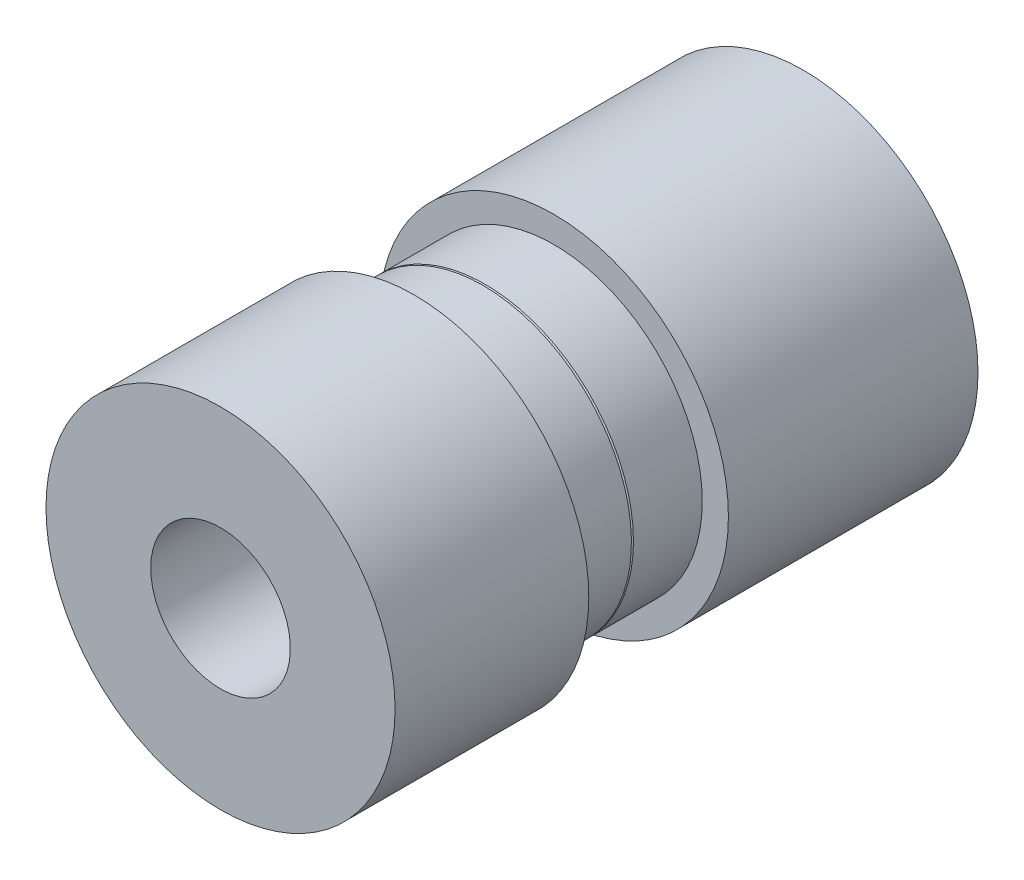
ISO-10303-21;
HEADER;
FILE_DESCRIPTION(('STEP AP214'),'2;1');
FILE_NAME('part.step','',(''),(''),'','','');
FILE_SCHEMA(('AUTOMOTIVE_DESIGN { 1 0 10303 214 1 1 1 1 }'));
ENDSEC;
DATA;
#1=APPLICATION_CONTEXT('core data for automotive mechanical design processes');
#2=APPLICATION_PROTOCOL_DEFINITION('international standard','automotive_design',2000,#1);
#3=PRODUCT_CONTEXT('',#1,'mechanical');
#4=PRODUCT('Part','Part','',(#3));
#5=PRODUCT_RELATED_PRODUCT_CATEGORY('part','',(#4));
#6=PRODUCT_DEFINITION_FORMATION('','',#4);
#7=PRODUCT_DEFINITION_CONTEXT('part definition',#1,'design');
#8=PRODUCT_DEFINITION('design','',#6,#7);
#9=PRODUCT_DEFINITION_SHAPE('','',#8);
#10=(LENGTH_UNIT() NAMED_UNIT(*) SI_UNIT(.MILLI.,.METRE.));
#11=(NAMED_UNIT(*) PLANE_ANGLE_UNIT() SI_UNIT($,.RADIAN.));
#12=(NAMED_UNIT(*) SI_UNIT($,.STERADIAN.) SOLID_ANGLE_UNIT());
#13=UNCERTAINTY_MEASURE_WITH_UNIT(LENGTH_MEASURE(1.E-05),#10,'distance_accuracy_value','');
#14=(GEOMETRIC_REPRESENTATION_CONTEXT(3) GLOBAL_UNCERTAINTY_ASSIGNED_CONTEXT((#13)) GLOBAL_UNIT_ASSIGNED_CONTEXT((#10,
#11,#12)) REPRESENTATION_CONTEXT('',''));
#15=CARTESIAN_POINT('',(0.,0.,0.));
#16=DIRECTION('',(0.,0.,1.));
#17=DIRECTION('',(1.,0.,0.));
#18=AXIS2_PLACEMENT_3D('',#15,#16,#17);
#19=CARTESIAN_POINT('',(0.,92.5,40.));
#20=DIRECTION('',(0.,0.,-1.));
#21=DIRECTION('',(-1.,0.,0.));
#22=AXIS2_PLACEMENT_3D('',#19,#20,#21);
#23=PLANE('',#22);
#24=CARTESIAN_POINT('',(0.,0.,40.));
#25=DIRECTION('',(0.,0.,-1.));
#26=DIRECTION('',(-1.,0.,0.));
#27=AXIS2_PLACEMENT_3D('',#24,#25,#26);
#28=CIRCLE('',#27,85.);
#29=CARTESIAN_POINT('',(-85.,0.,40.));
#30=VERTEX_POINT('',#29);
#31=EDGE_CURVE('E17',#30,#30,#28,.T.);
#32=ORIENTED_EDGE('',*,*,#31,.F.);
#33=EDGE_LOOP('',(#32));
#34=FACE_BOUND('',#33,.T.);
#35=CARTESIAN_POINT('',(0.,0.,40.));
#36=DIRECTION('',(0.,0.,-1.));
#37=DIRECTION('',(-1.,0.,0.));
#38=AXIS2_PLACEMENT_3D('',#35,#36,#37);
#39=CIRCLE('',#38,100.);
#40=CARTESIAN_POINT('',(-100.,0.,40.));
#41=VERTEX_POINT('',#40);
#42=EDGE_CURVE('E45',#41,#41,#39,.F.);
#43=ORIENTED_EDGE('',*,*,#42,.F.);
#44=EDGE_LOOP('',(#43));
#45=FACE_BOUND('',#44,.T.);
#46=ADVANCED_FACE('F14',(#34,#45),#23,.T.);
#47=CARTESIAN_POINT('',(0.,0.,20.2886751345948));
#48=DIRECTION('',(0.,0.,-1.));
#49=DIRECTION('',(-1.,0.,0.));
#50=AXIS2_PLACEMENT_3D('',#47,#48,#49);
#51=CYLINDRICAL_SURFACE('',#50,85.);
#52=ORIENTED_EDGE('',*,*,#31,.T.);
#53=EDGE_LOOP('',(#52));
#54=FACE_BOUND('',#53,.T.);
#55=CARTESIAN_POINT('',(0.,0.,0.577350269189626));
#56=DIRECTION('',(0.,0.,1.));
#57=DIRECTION('',(0.,1.,0.));
#58=AXIS2_PLACEMENT_3D('',#55,#56,#57);
#59=CIRCLE('',#58,85.);
#60=CARTESIAN_POINT('',(0.,85.,0.577350269189625));
#61=VERTEX_POINT('',#60);
#62=EDGE_CURVE('E44',#61,#61,#59,.F.);
#63=ORIENTED_EDGE('',*,*,#62,.F.);
#64=EDGE_LOOP('',(#63));
#65=FACE_BOUND('',#64,.T.);
#66=ADVANCED_FACE('F53',(#54,#65),#51,.T.);
#67=CARTESIAN_POINT('',(0.,0.,95.5));
#68=DIRECTION('',(0.,0.,-1.));
#69=DIRECTION('',(-1.,0.,0.));
#70=AXIS2_PLACEMENT_3D('',#67,#68,#69);
#71=CYLINDRICAL_SURFACE('',#70,100.);
#72=CARTESIAN_POINT('',(0.,0.,151.));
#73=DIRECTION('',(0.,0.,-1.));
#74=DIRECTION('',(-1.,0.,0.));
#75=AXIS2_PLACEMENT_3D('',#72,#73,#74);
#76=CIRCLE('',#75,100.);
#77=CARTESIAN_POINT('',(-100.,0.,151.));
#78=VERTEX_POINT('',#77);
#79=EDGE_CURVE('E42',#78,#78,#76,.F.);
#80=ORIENTED_EDGE('',*,*,#79,.F.);
#81=EDGE_LOOP('',(#80));
#82=FACE_BOUND('',#81,.T.);
#83=ORIENTED_EDGE('',*,*,#42,.T.);
#84=EDGE_LOOP('',(#83));
#85=FACE_BOUND('',#84,.T.);
#86=ADVANCED_FACE('F62',(#82,#85),#71,.T.);
#87=CARTESIAN_POINT('',(0.,0.,0.577350269189625));
#88=DIRECTION('',(0.,0.,1.));
#89=DIRECTION('',(1.,0.,0.));
#90=AXIS2_PLACEMENT_3D('',#87,#88,#89);
#91=CONICAL_SURFACE('',#90,85.,1.0471975511966);
#92=ORIENTED_EDGE('',*,*,#62,.T.);
#93=EDGE_LOOP('',(#92));
#94=FACE_BOUND('',#93,.T.);
#95=CARTESIAN_POINT('',(0.,0.,0.));
#96=DIRECTION('',(0.,0.,-1.));
#97=DIRECTION('',(0.,1.,0.));
#98=AXIS2_PLACEMENT_3D('',#95,#96,#97);
#99=CIRCLE('',#98,84.);
#100=CARTESIAN_POINT('',(0.,84.,0.));
#101=VERTEX_POINT('',#100);
#102=EDGE_CURVE('E41',#101,#101,#99,.T.);
#103=ORIENTED_EDGE('',*,*,#102,.F.);
#104=EDGE_LOOP('',(#103));
#105=FACE_BOUND('',#104,.T.);
#106=ADVANCED_FACE('F93',(#94,#105),#91,.T.);
#107=CARTESIAN_POINT('',(0.,70.,151.));
#108=DIRECTION('',(0.,0.,1.));
#109=DIRECTION('',(1.,0.,0.));
#110=AXIS2_PLACEMENT_3D('',#107,#108,#109);
#111=PLANE('',#110);
#112=CARTESIAN_POINT('',(0.,0.,151.));
#113=DIRECTION('',(0.,0.,-1.));
#114=DIRECTION('',(-1.,0.,0.));
#115=AXIS2_PLACEMENT_3D('',#112,#113,#114);
#116=CIRCLE('',#115,40.);
#117=CARTESIAN_POINT('',(-40.,0.,151.));
#118=VERTEX_POINT('',#117);
#119=EDGE_CURVE('E38',#118,#118,#116,.T.);
#120=ORIENTED_EDGE('',*,*,#119,.T.);
#121=EDGE_LOOP('',(#120));
#122=FACE_BOUND('',#121,.T.);
#123=ORIENTED_EDGE('',*,*,#79,.T.);
#124=EDGE_LOOP('',(#123));
#125=FACE_BOUND('',#124,.T.);
#126=ADVANCED_FACE('F89',(#122,#125),#111,.T.);
#127=CARTESIAN_POINT('',(0.,0.,-0.577350269189622));
#128=DIRECTION('',(0.,0.,-1.));
#129=DIRECTION('',(-1.,0.,0.));
#130=AXIS2_PLACEMENT_3D('',#127,#128,#129);
#131=CONICAL_SURFACE('',#130,85.,1.0471975511966);
#132=ORIENTED_EDGE('',*,*,#102,.T.);
#133=EDGE_LOOP('',(#132));
#134=FACE_BOUND('',#133,.T.);
#135=CARTESIAN_POINT('',(0.,0.,-0.577350269189619));
#136=DIRECTION('',(0.,0.,-1.));
#137=DIRECTION('',(-1.,0.,0.));
#138=AXIS2_PLACEMENT_3D('',#135,#136,#137);
#139=CIRCLE('',#138,85.);
#140=CARTESIAN_POINT('',(-85.,0.,-0.577350269189619));
#141=VERTEX_POINT('',#140);
#142=EDGE_CURVE('E37',#141,#141,#139,.T.);
#143=ORIENTED_EDGE('',*,*,#142,.F.);
#144=EDGE_LOOP('',(#143));
#145=FACE_BOUND('',#144,.T.);
#146=ADVANCED_FACE('F85',(#134,#145),#131,.T.);
#147=CARTESIAN_POINT('',(0.,0.,75.5));
#148=DIRECTION('',(0.,0.,-1.));
#149=DIRECTION('',(-1.,0.,0.));
#150=AXIS2_PLACEMENT_3D('',#147,#148,#149);
#151=CYLINDRICAL_SURFACE('',#150,40.);
#152=ORIENTED_EDGE('',*,*,#119,.F.);
#153=EDGE_LOOP('',(#152));
#154=FACE_BOUND('',#153,.T.);
#155=CARTESIAN_POINT('',(0.,0.,-183.));
#156=DIRECTION('',(0.,0.,-1.));
#157=DIRECTION('',(-1.,0.,0.));
#158=AXIS2_PLACEMENT_3D('',#155,#156,#157);
#159=CIRCLE('',#158,40.);
#160=CARTESIAN_POINT('',(-40.,0.,-183.));
#161=VERTEX_POINT('',#160);
#162=EDGE_CURVE('E34',#161,#161,#159,.F.);
#163=ORIENTED_EDGE('',*,*,#162,.F.);
#164=EDGE_LOOP('',(#163));
#165=FACE_BOUND('',#164,.T.);
#166=ADVANCED_FACE('F81',(#154,#165),#151,.F.);
#167=CARTESIAN_POINT('',(0.,0.,-20.2886751345948));
#168=DIRECTION('',(0.,0.,-1.));
#169=DIRECTION('',(-1.,0.,0.));
#170=AXIS2_PLACEMENT_3D('',#167,#168,#169);
#171=CYLINDRICAL_SURFACE('',#170,85.);
#172=ORIENTED_EDGE('',*,*,#142,.T.);
#173=EDGE_LOOP('',(#172));
#174=FACE_BOUND('',#173,.T.);
#175=CARTESIAN_POINT('',(0.,0.,-40.));
#176=DIRECTION('',(0.,0.,-1.));
#177=DIRECTION('',(-1.,0.,0.));
#178=AXIS2_PLACEMENT_3D('',#175,#176,#177);
#179=CIRCLE('',#178,85.);
#180=CARTESIAN_POINT('',(-85.,0.,-40.));
#181=VERTEX_POINT('',#180);
#182=EDGE_CURVE('E26',#181,#181,#179,.T.);
#183=ORIENTED_EDGE('',*,*,#182,.F.);
#184=EDGE_LOOP('',(#183));
#185=FACE_BOUND('',#184,.T.);
#186=ADVANCED_FACE('F77',(#174,#185),#171,.T.);
#187=CARTESIAN_POINT('',(0.,70.,-183.));
#188=DIRECTION('',(0.,0.,-1.));
#189=DIRECTION('',(-1.,0.,0.));
#190=AXIS2_PLACEMENT_3D('',#187,#188,#189);
#191=PLANE('',#190);
#192=ORIENTED_EDGE('',*,*,#162,.T.);
#193=EDGE_LOOP('',(#192));
#194=FACE_BOUND('',#193,.T.);
#195=CARTESIAN_POINT('',(0.,0.,-183.));
#196=DIRECTION('',(0.,0.,-1.));
#197=DIRECTION('',(-1.,0.,0.));
#198=AXIS2_PLACEMENT_3D('',#195,#196,#197);
#199=CIRCLE('',#198,100.);
#200=CARTESIAN_POINT('',(-100.,0.,-183.));
#201=VERTEX_POINT('',#200);
#202=EDGE_CURVE('E21',#201,#201,#199,.F.);
#203=ORIENTED_EDGE('',*,*,#202,.F.);
#204=EDGE_LOOP('',(#203));
#205=FACE_BOUND('',#204,.T.);
#206=ADVANCED_FACE('F70',(#194,#205),#191,.T.);
#207=CARTESIAN_POINT('',(0.,92.5,-40.));
#208=DIRECTION('',(0.,0.,1.));
#209=DIRECTION('',(1.,0.,0.));
#210=AXIS2_PLACEMENT_3D('',#207,#208,#209);
#211=PLANE('',#210);
#212=ORIENTED_EDGE('',*,*,#182,.T.);
#213=EDGE_LOOP('',(#212));
#214=FACE_BOUND('',#213,.T.);
#215=CARTESIAN_POINT('',(0.,0.,-40.));
#216=DIRECTION('',(0.,0.,-1.));
#217=DIRECTION('',(-1.,0.,0.));
#218=AXIS2_PLACEMENT_3D('',#215,#216,#217);
#219=CIRCLE('',#218,100.);
#220=CARTESIAN_POINT('',(-100.,0.,-40.));
#221=VERTEX_POINT('',#220);
#222=EDGE_CURVE('E10',#221,#221,#219,.T.);
#223=ORIENTED_EDGE('',*,*,#222,.F.);
#224=EDGE_LOOP('',(#223));
#225=FACE_BOUND('',#224,.T.);
#226=ADVANCED_FACE('F65',(#214,#225),#211,.T.);
#227=CARTESIAN_POINT('',(0.,0.,-111.5));
#228=DIRECTION('',(0.,0.,-1.));
#229=DIRECTION('',(-1.,0.,0.));
#230=AXIS2_PLACEMENT_3D('',#227,#228,#229);
#231=CYLINDRICAL_SURFACE('',#230,100.);
#232=ORIENTED_EDGE('',*,*,#222,.T.);
#233=EDGE_LOOP('',(#232));
#234=FACE_BOUND('',#233,.T.);
#235=ORIENTED_EDGE('',*,*,#202,.T.);
#236=EDGE_LOOP('',(#235));
#237=FACE_BOUND('',#236,.T.);
#238=ADVANCED_FACE('F63',(#234,#237),#231,.T.);
#239=CLOSED_SHELL('',(#46,#66,#86,#106,#126,#146,#166,#186,#206,#226,#238));
#240=MANIFOLD_SOLID_BREP('B1',#239);
#241=ADVANCED_BREP_SHAPE_REPRESENTATION('',(#18,#240),#14);
#242=SHAPE_DEFINITION_REPRESENTATION(#9,#241);
ENDSEC;
END-ISO-10303-21;
